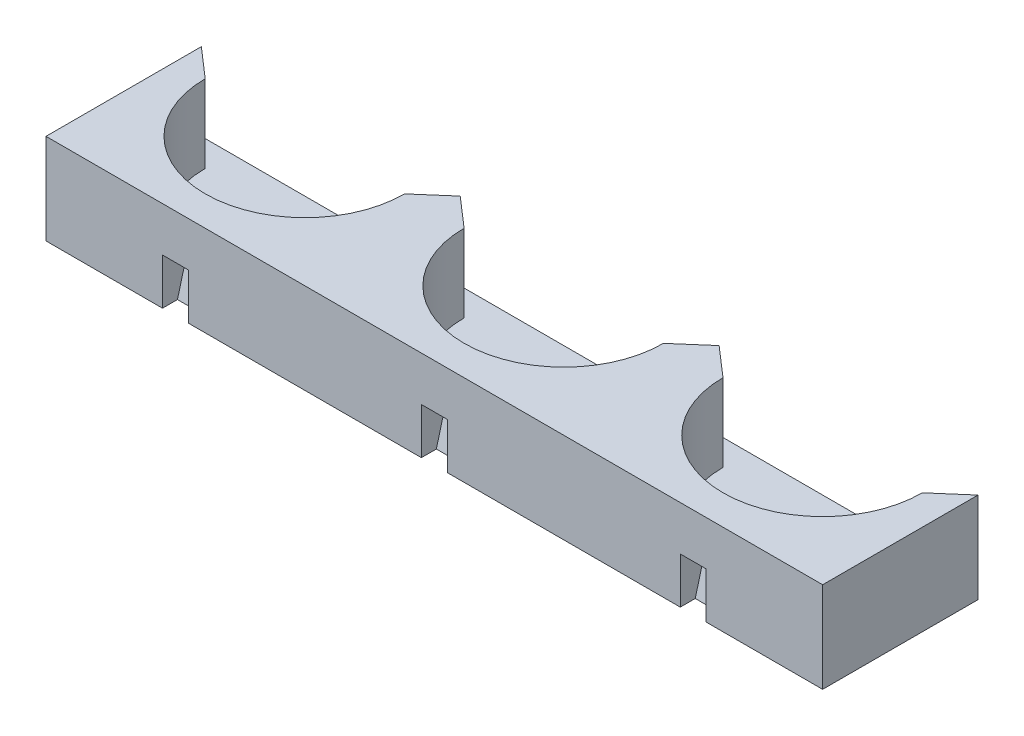
ISO-10303-21;
HEADER;
FILE_DESCRIPTION(('STEP AP214'),'2;1');
FILE_NAME('part.step','',(''),(''),'','','');
FILE_SCHEMA(('AUTOMOTIVE_DESIGN { 1 0 10303 214 1 1 1 1 }'));
ENDSEC;
DATA;
#1=APPLICATION_CONTEXT('core data for automotive mechanical design processes');
#2=APPLICATION_PROTOCOL_DEFINITION('international standard','automotive_design',2000,#1);
#3=PRODUCT_CONTEXT('',#1,'mechanical');
#4=PRODUCT('Part','Part','',(#3));
#5=PRODUCT_RELATED_PRODUCT_CATEGORY('part','',(#4));
#6=PRODUCT_DEFINITION_FORMATION('','',#4);
#7=PRODUCT_DEFINITION_CONTEXT('part definition',#1,'design');
#8=PRODUCT_DEFINITION('design','',#6,#7);
#9=PRODUCT_DEFINITION_SHAPE('','',#8);
#10=(LENGTH_UNIT() NAMED_UNIT(*) SI_UNIT(.MILLI.,.METRE.));
#11=(NAMED_UNIT(*) PLANE_ANGLE_UNIT() SI_UNIT($,.RADIAN.));
#12=(NAMED_UNIT(*) SI_UNIT($,.STERADIAN.) SOLID_ANGLE_UNIT());
#13=UNCERTAINTY_MEASURE_WITH_UNIT(LENGTH_MEASURE(1.E-05),#10,'distance_accuracy_value','');
#14=(GEOMETRIC_REPRESENTATION_CONTEXT(3) GLOBAL_UNCERTAINTY_ASSIGNED_CONTEXT((#13)) GLOBAL_UNIT_ASSIGNED_CONTEXT((#10,
#11,#12)) REPRESENTATION_CONTEXT('',''));
#15=CARTESIAN_POINT('',(0.,0.,0.));
#16=DIRECTION('',(0.,0.,1.));
#17=DIRECTION('',(1.,0.,0.));
#18=AXIS2_PLACEMENT_3D('',#15,#16,#17);
#19=CARTESIAN_POINT('',(255.,8.99626522292862,-3.75028796353544));
#20=DIRECTION('',(1.,0.,0.));
#21=DIRECTION('',(0.,0.,-1.));
#22=AXIS2_PLACEMENT_3D('',#19,#20,#21);
#23=PLANE('',#22);
#24=DIRECTION('',(0.,0.370686519168984,0.928758044113957));
#25=VECTOR('',#24,1.);
#26=CARTESIAN_POINT('',(255.,8.99626522292862,-9.53028796353547));
#27=LINE('',#26,#25);
#28=CARTESIAN_POINT('',(255.,8.99626522292862,-9.53028796353547));
#29=VERTEX_POINT('',#28);
#30=CARTESIAN_POINT('',(255.,12.8,0.));
#31=VERTEX_POINT('',#30);
#32=EDGE_CURVE('E376',#29,#31,#27,.T.);
#33=ORIENTED_EDGE('',*,*,#32,.F.);
#34=DIRECTION('',(0.,-0.96592582628907,0.258819045102515));
#35=VECTOR('',#34,1.);
#36=CARTESIAN_POINT('',(255.,8.99626522292862,-9.53028796353544));
#37=LINE('',#36,#35);
#38=CARTESIAN_POINT('',(255.,-5.,-5.78000000000001));
#39=VERTEX_POINT('',#38);
#40=EDGE_CURVE('E414',#29,#39,#37,.T.);
#41=ORIENTED_EDGE('',*,*,#40,.T.);
#42=DIRECTION('',(0.,0.,1.));
#43=VECTOR('',#42,1.);
#44=CARTESIAN_POINT('',(255.,-5.,0.));
#45=LINE('',#44,#43);
#46=CARTESIAN_POINT('',(255.,-5.,0.));
#47=VERTEX_POINT('',#46);
#48=EDGE_CURVE('E404',#39,#47,#45,.T.);
#49=ORIENTED_EDGE('',*,*,#48,.T.);
#50=DIRECTION('',(0.,1.,0.));
#51=VECTOR('',#50,1.);
#52=CARTESIAN_POINT('',(255.,-5.,0.));
#53=LINE('',#52,#51);
#54=EDGE_CURVE('E208',#47,#31,#53,.T.);
#55=ORIENTED_EDGE('',*,*,#54,.T.);
#56=EDGE_LOOP('',(#33,#41,#49,#55));
#57=FACE_BOUND('',#56,.T.);
#58=ADVANCED_FACE('F33',(#57),#23,.F.);
#59=CARTESIAN_POINT('',(245.,8.99626522292862,-3.75028796353544));
#60=DIRECTION('',(-1.,0.,0.));
#61=DIRECTION('',(0.,0.,1.));
#62=AXIS2_PLACEMENT_3D('',#59,#60,#61);
#63=PLANE('',#62);
#64=DIRECTION('',(0.,0.370686519168984,0.928758044113957));
#65=VECTOR('',#64,1.);
#66=CARTESIAN_POINT('',(245.,8.99626522292862,-9.53028796353547));
#67=LINE('',#66,#65);
#68=CARTESIAN_POINT('',(245.,8.99626522292862,-9.53028796353544));
#69=VERTEX_POINT('',#68);
#70=CARTESIAN_POINT('',(245.,12.8,0.));
#71=VERTEX_POINT('',#70);
#72=EDGE_CURVE('E448',#69,#71,#67,.T.);
#73=ORIENTED_EDGE('',*,*,#72,.T.);
#74=DIRECTION('',(0.,-1.,0.));
#75=VECTOR('',#74,1.);
#76=CARTESIAN_POINT('',(245.,-5.,0.));
#77=LINE('',#76,#75);
#78=CARTESIAN_POINT('',(245.,-5.,0.));
#79=VERTEX_POINT('',#78);
#80=EDGE_CURVE('E397',#71,#79,#77,.T.);
#81=ORIENTED_EDGE('',*,*,#80,.T.);
#82=DIRECTION('',(0.,0.,-1.));
#83=VECTOR('',#82,1.);
#84=CARTESIAN_POINT('',(245.,-5.,0.));
#85=LINE('',#84,#83);
#86=CARTESIAN_POINT('',(245.,-5.,-5.78000000000001));
#87=VERTEX_POINT('',#86);
#88=EDGE_CURVE('E420',#79,#87,#85,.T.);
#89=ORIENTED_EDGE('',*,*,#88,.T.);
#90=DIRECTION('',(0.,-0.96592582628907,0.258819045102515));
#91=VECTOR('',#90,1.);
#92=CARTESIAN_POINT('',(245.,8.99626522292862,-9.53028796353544));
#93=LINE('',#92,#91);
#94=EDGE_CURVE('E411',#69,#87,#93,.T.);
#95=ORIENTED_EDGE('',*,*,#94,.F.);
#96=EDGE_LOOP('',(#73,#81,#89,#95));
#97=FACE_BOUND('',#96,.T.);
#98=ADVANCED_FACE('F462',(#97),#63,.F.);
#99=CARTESIAN_POINT('',(155.,8.99626522292862,-3.75028796353546));
#100=DIRECTION('',(1.,0.,0.));
#101=DIRECTION('',(0.,0.,-1.));
#102=AXIS2_PLACEMENT_3D('',#99,#100,#101);
#103=PLANE('',#102);
#104=DIRECTION('',(0.,0.370686519168984,0.928758044113957));
#105=VECTOR('',#104,1.);
#106=CARTESIAN_POINT('',(155.,8.99626522292862,-9.53028796353547));
#107=LINE('',#106,#105);
#108=CARTESIAN_POINT('',(155.,8.99626522292862,-9.53028796353547));
#109=VERTEX_POINT('',#108);
#110=CARTESIAN_POINT('',(155.,12.8,0.));
#111=VERTEX_POINT('',#110);
#112=EDGE_CURVE('E364',#109,#111,#107,.T.);
#113=ORIENTED_EDGE('',*,*,#112,.F.);
#114=DIRECTION('',(0.,-0.96592582628907,0.258819045102515));
#115=VECTOR('',#114,1.);
#116=CARTESIAN_POINT('',(155.,8.99626522292862,-9.53028796353546));
#117=LINE('',#116,#115);
#118=CARTESIAN_POINT('',(155.,-5.,-5.78000000000003));
#119=VERTEX_POINT('',#118);
#120=EDGE_CURVE('E368',#109,#119,#117,.T.);
#121=ORIENTED_EDGE('',*,*,#120,.T.);
#122=DIRECTION('',(0.,0.,1.));
#123=VECTOR('',#122,1.);
#124=CARTESIAN_POINT('',(155.,-5.,0.));
#125=LINE('',#124,#123);
#126=CARTESIAN_POINT('',(155.,-5.,0.));
#127=VERTEX_POINT('',#126);
#128=EDGE_CURVE('E396',#119,#127,#125,.T.);
#129=ORIENTED_EDGE('',*,*,#128,.T.);
#130=DIRECTION('',(0.,1.,0.));
#131=VECTOR('',#130,1.);
#132=CARTESIAN_POINT('',(155.,-5.,0.));
#133=LINE('',#132,#131);
#134=EDGE_CURVE('E371',#127,#111,#133,.T.);
#135=ORIENTED_EDGE('',*,*,#134,.T.);
#136=EDGE_LOOP('',(#113,#121,#129,#135));
#137=FACE_BOUND('',#136,.T.);
#138=ADVANCED_FACE('F366',(#137),#103,.F.);
#139=CARTESIAN_POINT('',(145.,8.99626522292862,-3.75028796353547));
#140=DIRECTION('',(-1.,0.,0.));
#141=DIRECTION('',(0.,0.,1.));
#142=AXIS2_PLACEMENT_3D('',#139,#140,#141);
#143=PLANE('',#142);
#144=DIRECTION('',(0.,0.370686519168984,0.928758044113957));
#145=VECTOR('',#144,1.);
#146=CARTESIAN_POINT('',(145.,8.99626522292862,-9.53028796353547));
#147=LINE('',#146,#145);
#148=CARTESIAN_POINT('',(145.,8.99626522292862,-9.53028796353547));
#149=VERTEX_POINT('',#148);
#150=CARTESIAN_POINT('',(145.,12.8,0.));
#151=VERTEX_POINT('',#150);
#152=EDGE_CURVE('E375',#149,#151,#147,.T.);
#153=ORIENTED_EDGE('',*,*,#152,.T.);
#154=DIRECTION('',(0.,-1.,0.));
#155=VECTOR('',#154,1.);
#156=CARTESIAN_POINT('',(145.,-5.,0.));
#157=LINE('',#156,#155);
#158=CARTESIAN_POINT('',(145.,-5.,0.));
#159=VERTEX_POINT('',#158);
#160=EDGE_CURVE('E433',#151,#159,#157,.T.);
#161=ORIENTED_EDGE('',*,*,#160,.T.);
#162=DIRECTION('',(0.,0.,-1.));
#163=VECTOR('',#162,1.);
#164=CARTESIAN_POINT('',(145.,-5.,0.));
#165=LINE('',#164,#163);
#166=CARTESIAN_POINT('',(145.,-5.,-5.78000000000003));
#167=VERTEX_POINT('',#166);
#168=EDGE_CURVE('E394',#159,#167,#165,.T.);
#169=ORIENTED_EDGE('',*,*,#168,.T.);
#170=DIRECTION('',(0.,-0.96592582628907,0.258819045102515));
#171=VECTOR('',#170,1.);
#172=CARTESIAN_POINT('',(145.,8.99626522292862,-9.53028796353547));
#173=LINE('',#172,#171);
#174=EDGE_CURVE('E230',#149,#167,#173,.T.);
#175=ORIENTED_EDGE('',*,*,#174,.F.);
#176=EDGE_LOOP('',(#153,#161,#169,#175));
#177=FACE_BOUND('',#176,.T.);
#178=ADVANCED_FACE('F504',(#177),#143,.F.);
#179=CARTESIAN_POINT('',(45.,8.99626522292862,-3.75028796353544));
#180=DIRECTION('',(-1.,0.,0.));
#181=DIRECTION('',(0.,0.,1.));
#182=AXIS2_PLACEMENT_3D('',#179,#180,#181);
#183=PLANE('',#182);
#184=DIRECTION('',(0.,0.370686519168984,0.928758044113957));
#185=VECTOR('',#184,1.);
#186=CARTESIAN_POINT('',(45.,8.99626522292862,-9.53028796353547));
#187=LINE('',#186,#185);
#188=CARTESIAN_POINT('',(45.,8.99626522292862,-9.53028796353547));
#189=VERTEX_POINT('',#188);
#190=CARTESIAN_POINT('',(45.,12.8,0.));
#191=VERTEX_POINT('',#190);
#192=EDGE_CURVE('E432',#189,#191,#187,.T.);
#193=ORIENTED_EDGE('',*,*,#192,.T.);
#194=DIRECTION('',(0.,-1.,0.));
#195=VECTOR('',#194,1.);
#196=CARTESIAN_POINT('',(45.,-5.,0.));
#197=LINE('',#196,#195);
#198=CARTESIAN_POINT('',(45.,-5.,0.));
#199=VERTEX_POINT('',#198);
#200=EDGE_CURVE('E425',#191,#199,#197,.T.);
#201=ORIENTED_EDGE('',*,*,#200,.T.);
#202=DIRECTION('',(0.,0.,-1.));
#203=VECTOR('',#202,1.);
#204=CARTESIAN_POINT('',(45.,-5.,0.));
#205=LINE('',#204,#203);
#206=CARTESIAN_POINT('',(45.,-5.,-5.78000000000003));
#207=VERTEX_POINT('',#206);
#208=EDGE_CURVE('E48',#199,#207,#205,.T.);
#209=ORIENTED_EDGE('',*,*,#208,.T.);
#210=DIRECTION('',(0.,-0.96592582628907,0.258819045102515));
#211=VECTOR('',#210,1.);
#212=CARTESIAN_POINT('',(45.,8.99626522292862,-9.53028796353547));
#213=LINE('',#212,#211);
#214=EDGE_CURVE('E399',#189,#207,#213,.T.);
#215=ORIENTED_EDGE('',*,*,#214,.F.);
#216=EDGE_LOOP('',(#193,#201,#209,#215));
#217=FACE_BOUND('',#216,.T.);
#218=ADVANCED_FACE('F479',(#217),#183,.F.);
#219=CARTESIAN_POINT('',(55.,8.99626522292862,-3.75028796353544));
#220=DIRECTION('',(1.,0.,0.));
#221=DIRECTION('',(0.,0.,-1.));
#222=AXIS2_PLACEMENT_3D('',#219,#220,#221);
#223=PLANE('',#222);
#224=DIRECTION('',(0.,0.370686519168984,0.928758044113957));
#225=VECTOR('',#224,1.);
#226=CARTESIAN_POINT('',(55.,8.99626522292862,-9.53028796353547));
#227=LINE('',#226,#225);
#228=CARTESIAN_POINT('',(55.,8.99626522292862,-9.53028796353547));
#229=VERTEX_POINT('',#228);
#230=CARTESIAN_POINT('',(55.,12.8,0.));
#231=VERTEX_POINT('',#230);
#232=EDGE_CURVE('E445',#229,#231,#227,.T.);
#233=ORIENTED_EDGE('',*,*,#232,.F.);
#234=DIRECTION('',(0.,-0.96592582628907,0.258819045102515));
#235=VECTOR('',#234,1.);
#236=CARTESIAN_POINT('',(55.,8.99626522292862,-9.53028796353547));
#237=LINE('',#236,#235);
#238=CARTESIAN_POINT('',(55.,-5.,-5.78000000000003));
#239=VERTEX_POINT('',#238);
#240=EDGE_CURVE('E401',#229,#239,#237,.T.);
#241=ORIENTED_EDGE('',*,*,#240,.T.);
#242=DIRECTION('',(0.,0.,1.));
#243=VECTOR('',#242,1.);
#244=CARTESIAN_POINT('',(55.,-5.,0.));
#245=LINE('',#244,#243);
#246=CARTESIAN_POINT('',(55.,-5.,0.));
#247=VERTEX_POINT('',#246);
#248=EDGE_CURVE('E405',#239,#247,#245,.T.);
#249=ORIENTED_EDGE('',*,*,#248,.T.);
#250=DIRECTION('',(0.,1.,0.));
#251=VECTOR('',#250,1.);
#252=CARTESIAN_POINT('',(55.,-5.,0.));
#253=LINE('',#252,#251);
#254=EDGE_CURVE('E429',#247,#231,#253,.T.);
#255=ORIENTED_EDGE('',*,*,#254,.T.);
#256=EDGE_LOOP('',(#233,#241,#249,#255));
#257=FACE_BOUND('',#256,.T.);
#258=ADVANCED_FACE('F474',(#257),#223,.F.);
#259=CARTESIAN_POINT('',(0.,30.,0.));
#260=DIRECTION('',(1.,0.,0.));
#261=DIRECTION('',(0.,0.,-1.));
#262=AXIS2_PLACEMENT_3D('',#259,#260,#261);
#263=PLANE('',#262);
#264=DIRECTION('',(0.,-1.,0.));
#265=VECTOR('',#264,1.);
#266=CARTESIAN_POINT('',(0.,30.,-60.));
#267=LINE('',#266,#265);
#268=CARTESIAN_POINT('',(0.,30.,-60.));
#269=VERTEX_POINT('',#268);
#270=CARTESIAN_POINT('',(0.,0.,-60.));
#271=VERTEX_POINT('',#270);
#272=EDGE_CURVE('E137',#269,#271,#267,.T.);
#273=ORIENTED_EDGE('',*,*,#272,.T.);
#274=DIRECTION('',(0.,1.,0.));
#275=VECTOR('',#274,1.);
#276=CARTESIAN_POINT('',(0.,-5.,-60.));
#277=LINE('',#276,#275);
#278=CARTESIAN_POINT('',(0.,-5.,-60.));
#279=VERTEX_POINT('',#278);
#280=EDGE_CURVE('E143',#279,#271,#277,.T.);
#281=ORIENTED_EDGE('',*,*,#280,.F.);
#282=DIRECTION('',(0.,0.,-1.));
#283=VECTOR('',#282,1.);
#284=CARTESIAN_POINT('',(0.,-5.,-60.));
#285=LINE('',#284,#283);
#286=CARTESIAN_POINT('',(0.,-5.,0.));
#287=VERTEX_POINT('',#286);
#288=EDGE_CURVE('E211',#287,#279,#285,.T.);
#289=ORIENTED_EDGE('',*,*,#288,.F.);
#290=DIRECTION('',(0.,-1.,0.));
#291=VECTOR('',#290,1.);
#292=CARTESIAN_POINT('',(0.,30.,0.));
#293=LINE('',#292,#291);
#294=CARTESIAN_POINT('',(0.,30.,0.));
#295=VERTEX_POINT('',#294);
#296=EDGE_CURVE('E11',#295,#287,#293,.T.);
#297=ORIENTED_EDGE('',*,*,#296,.F.);
#298=DIRECTION('',(0.,0.,1.));
#299=VECTOR('',#298,1.);
#300=CARTESIAN_POINT('',(0.,30.,0.));
#301=LINE('',#300,#299);
#302=EDGE_CURVE('E161',#269,#295,#301,.T.);
#303=ORIENTED_EDGE('',*,*,#302,.F.);
#304=EDGE_LOOP('',(#273,#281,#289,#297,#303));
#305=FACE_BOUND('',#304,.T.);
#306=ADVANCED_FACE('F35',(#305),#263,.F.);
#307=CARTESIAN_POINT('',(0.,30.,0.));
#308=DIRECTION('',(0.,0.,-1.));
#309=DIRECTION('',(-1.,0.,0.));
#310=AXIS2_PLACEMENT_3D('',#307,#308,#309);
#311=PLANE('',#310);
#312=DIRECTION('',(-1.,0.,0.));
#313=VECTOR('',#312,1.);
#314=CARTESIAN_POINT('',(255.,12.8,0.));
#315=LINE('',#314,#313);
#316=EDGE_CURVE('E439',#31,#71,#315,.T.);
#317=ORIENTED_EDGE('',*,*,#316,.F.);
#318=ORIENTED_EDGE('',*,*,#54,.F.);
#319=DIRECTION('',(-1.,0.,0.));
#320=VECTOR('',#319,1.);
#321=CARTESIAN_POINT('',(300.,-5.,0.));
#322=LINE('',#321,#320);
#323=CARTESIAN_POINT('',(300.,-5.,0.));
#324=VERTEX_POINT('',#323);
#325=EDGE_CURVE('E203',#324,#47,#322,.T.);
#326=ORIENTED_EDGE('',*,*,#325,.F.);
#327=DIRECTION('',(0.,-1.,0.));
#328=VECTOR('',#327,1.);
#329=CARTESIAN_POINT('',(300.,30.,0.));
#330=LINE('',#329,#328);
#331=CARTESIAN_POINT('',(300.,30.,0.));
#332=VERTEX_POINT('',#331);
#333=EDGE_CURVE('E41',#332,#324,#330,.T.);
#334=ORIENTED_EDGE('',*,*,#333,.F.);
#335=DIRECTION('',(1.,0.,0.));
#336=VECTOR('',#335,1.);
#337=CARTESIAN_POINT('',(0.,30.,0.));
#338=LINE('',#337,#336);
#339=EDGE_CURVE('E240',#295,#332,#338,.T.);
#340=ORIENTED_EDGE('',*,*,#339,.F.);
#341=ORIENTED_EDGE('',*,*,#296,.T.);
#342=EDGE_CURVE('E214',#199,#287,#322,.T.);
#343=ORIENTED_EDGE('',*,*,#342,.F.);
#344=ORIENTED_EDGE('',*,*,#200,.F.);
#345=DIRECTION('',(-1.,0.,0.));
#346=VECTOR('',#345,1.);
#347=CARTESIAN_POINT('',(55.,12.8,0.));
#348=LINE('',#347,#346);
#349=EDGE_CURVE('E427',#231,#191,#348,.T.);
#350=ORIENTED_EDGE('',*,*,#349,.F.);
#351=ORIENTED_EDGE('',*,*,#254,.F.);
#352=EDGE_CURVE('E224',#159,#247,#322,.T.);
#353=ORIENTED_EDGE('',*,*,#352,.F.);
#354=ORIENTED_EDGE('',*,*,#160,.F.);
#355=DIRECTION('',(-1.,0.,0.));
#356=VECTOR('',#355,1.);
#357=CARTESIAN_POINT('',(155.,12.8,0.));
#358=LINE('',#357,#356);
#359=EDGE_CURVE('E435',#111,#151,#358,.T.);
#360=ORIENTED_EDGE('',*,*,#359,.F.);
#361=ORIENTED_EDGE('',*,*,#134,.F.);
#362=EDGE_CURVE('E212',#79,#127,#322,.T.);
#363=ORIENTED_EDGE('',*,*,#362,.F.);
#364=ORIENTED_EDGE('',*,*,#80,.F.);
#365=EDGE_LOOP('',(#317,#318,#326,#334,#340,#341,#343,#344,#350,#351,#353,#354,#360,#361,#363,#364));
#366=FACE_BOUND('',#365,.T.);
#367=ADVANCED_FACE('F205',(#366),#311,.F.);
#368=CARTESIAN_POINT('',(300.,30.,0.));
#369=DIRECTION('',(-1.,0.,0.));
#370=DIRECTION('',(0.,0.,1.));
#371=AXIS2_PLACEMENT_3D('',#368,#369,#370);
#372=PLANE('',#371);
#373=ORIENTED_EDGE('',*,*,#333,.T.);
#374=DIRECTION('',(0.,0.,1.));
#375=VECTOR('',#374,1.);
#376=CARTESIAN_POINT('',(300.,-5.,-60.));
#377=LINE('',#376,#375);
#378=CARTESIAN_POINT('',(300.,-5.,-60.));
#379=VERTEX_POINT('',#378);
#380=EDGE_CURVE('E194',#379,#324,#377,.T.);
#381=ORIENTED_EDGE('',*,*,#380,.F.);
#382=DIRECTION('',(0.,1.,0.));
#383=VECTOR('',#382,1.);
#384=CARTESIAN_POINT('',(300.,-5.,-60.));
#385=LINE('',#384,#383);
#386=CARTESIAN_POINT('',(300.,0.,-60.));
#387=VERTEX_POINT('',#386);
#388=EDGE_CURVE('E234',#379,#387,#385,.T.);
#389=ORIENTED_EDGE('',*,*,#388,.T.);
#390=DIRECTION('',(0.,-1.,0.));
#391=VECTOR('',#390,1.);
#392=CARTESIAN_POINT('',(300.,30.,-60.));
#393=LINE('',#392,#391);
#394=CARTESIAN_POINT('',(300.,30.,-60.));
#395=VERTEX_POINT('',#394);
#396=EDGE_CURVE('E181',#395,#387,#393,.T.);
#397=ORIENTED_EDGE('',*,*,#396,.F.);
#398=DIRECTION('',(0.,0.,-1.));
#399=VECTOR('',#398,1.);
#400=CARTESIAN_POINT('',(300.,30.,0.));
#401=LINE('',#400,#399);
#402=EDGE_CURVE('E196',#332,#395,#401,.T.);
#403=ORIENTED_EDGE('',*,*,#402,.F.);
#404=EDGE_LOOP('',(#373,#381,#389,#397,#403));
#405=FACE_BOUND('',#404,.T.);
#406=ADVANCED_FACE('F190',(#405),#372,.F.);
#407=CARTESIAN_POINT('',(288.5,30.,-50.));
#408=DIRECTION('',(0.656178714924788,0.,0.754605522163504));
#409=DIRECTION('',(0.754605522163504,0.,-0.656178714924788));
#410=AXIS2_PLACEMENT_3D('',#407,#408,#409);
#411=PLANE('',#410);
#412=DIRECTION('',(-0.754605522163504,0.,0.656178714924788));
#413=VECTOR('',#412,1.);
#414=CARTESIAN_POINT('',(288.5,0.,-50.));
#415=LINE('',#414,#413);
#416=CARTESIAN_POINT('',(288.5,0.,-50.));
#417=VERTEX_POINT('',#416);
#418=EDGE_CURVE('E141',#387,#417,#415,.T.);
#419=ORIENTED_EDGE('',*,*,#418,.T.);
#420=DIRECTION('',(0.,-1.,0.));
#421=VECTOR('',#420,1.);
#422=CARTESIAN_POINT('',(288.5,30.,-50.));
#423=LINE('',#422,#421);
#424=CARTESIAN_POINT('',(288.5,30.,-50.));
#425=VERTEX_POINT('',#424);
#426=EDGE_CURVE('E178',#425,#417,#423,.T.);
#427=ORIENTED_EDGE('',*,*,#426,.F.);
#428=DIRECTION('',(-0.754605522163504,0.,0.656178714924788));
#429=VECTOR('',#428,1.);
#430=CARTESIAN_POINT('',(288.5,30.,-50.));
#431=LINE('',#430,#429);
#432=EDGE_CURVE('E243',#395,#425,#431,.T.);
#433=ORIENTED_EDGE('',*,*,#432,.F.);
#434=ORIENTED_EDGE('',*,*,#396,.T.);
#435=EDGE_LOOP('',(#419,#427,#433,#434));
#436=FACE_BOUND('',#435,.T.);
#437=ADVANCED_FACE('F541',(#436),#411,.F.);
#438=CARTESIAN_POINT('',(250.,30.,-50.));
#439=DIRECTION('',(0.,-1.,0.));
#440=DIRECTION('',(0.,0.,-1.));
#441=AXIS2_PLACEMENT_3D('',#438,#439,#440);
#442=CYLINDRICAL_SURFACE('',#441,38.5);
#443=CARTESIAN_POINT('',(250.,0.,-50.));
#444=DIRECTION('',(0.,-1.,0.));
#445=DIRECTION('',(0.,0.,-1.));
#446=AXIS2_PLACEMENT_3D('',#443,#444,#445);
#447=CIRCLE('',#446,38.5);
#448=CARTESIAN_POINT('',(211.5,0.,-50.));
#449=VERTEX_POINT('',#448);
#450=EDGE_CURVE('E70',#417,#449,#447,.T.);
#451=ORIENTED_EDGE('',*,*,#450,.T.);
#452=DIRECTION('',(0.,-1.,0.));
#453=VECTOR('',#452,1.);
#454=CARTESIAN_POINT('',(211.5,30.,-50.));
#455=LINE('',#454,#453);
#456=CARTESIAN_POINT('',(211.5,30.,-50.));
#457=VERTEX_POINT('',#456);
#458=EDGE_CURVE('E175',#457,#449,#455,.T.);
#459=ORIENTED_EDGE('',*,*,#458,.F.);
#460=CARTESIAN_POINT('',(250.,30.,-50.));
#461=DIRECTION('',(0.,-1.,0.));
#462=DIRECTION('',(0.,0.,-1.));
#463=AXIS2_PLACEMENT_3D('',#460,#461,#462);
#464=CIRCLE('',#463,38.5);
#465=EDGE_CURVE('E245',#425,#457,#464,.T.);
#466=ORIENTED_EDGE('',*,*,#465,.F.);
#467=ORIENTED_EDGE('',*,*,#426,.T.);
#468=EDGE_LOOP('',(#451,#459,#466,#467));
#469=FACE_BOUND('',#468,.T.);
#470=ADVANCED_FACE('F537',(#469),#442,.F.);
#471=CARTESIAN_POINT('',(200.,30.,-60.));
#472=DIRECTION('',(-0.656178714924787,0.,0.754605522163504));
#473=DIRECTION('',(0.754605522163505,0.,0.656178714924787));
#474=AXIS2_PLACEMENT_3D('',#471,#472,#473);
#475=PLANE('',#474);
#476=DIRECTION('',(-0.754605522163504,0.,-0.656178714924787));
#477=VECTOR('',#476,1.);
#478=CARTESIAN_POINT('',(200.,0.,-60.));
#479=LINE('',#478,#477);
#480=CARTESIAN_POINT('',(200.,0.,-60.));
#481=VERTEX_POINT('',#480);
#482=EDGE_CURVE('E145',#449,#481,#479,.T.);
#483=ORIENTED_EDGE('',*,*,#482,.T.);
#484=DIRECTION('',(0.,-1.,0.));
#485=VECTOR('',#484,1.);
#486=CARTESIAN_POINT('',(200.,30.,-60.));
#487=LINE('',#486,#485);
#488=CARTESIAN_POINT('',(200.,30.,-60.));
#489=VERTEX_POINT('',#488);
#490=EDGE_CURVE('E172',#489,#481,#487,.T.);
#491=ORIENTED_EDGE('',*,*,#490,.F.);
#492=DIRECTION('',(-0.754605522163504,0.,-0.656178714924787));
#493=VECTOR('',#492,1.);
#494=CARTESIAN_POINT('',(200.,30.,-60.));
#495=LINE('',#494,#493);
#496=EDGE_CURVE('E247',#457,#489,#495,.T.);
#497=ORIENTED_EDGE('',*,*,#496,.F.);
#498=ORIENTED_EDGE('',*,*,#458,.T.);
#499=EDGE_LOOP('',(#483,#491,#497,#498));
#500=FACE_BOUND('',#499,.T.);
#501=ADVANCED_FACE('F533',(#500),#475,.F.);
#502=CARTESIAN_POINT('',(188.5,30.,-50.));
#503=DIRECTION('',(0.656178714924787,0.,0.754605522163505));
#504=DIRECTION('',(0.754605522163505,0.,-0.656178714924787));
#505=AXIS2_PLACEMENT_3D('',#502,#503,#504);
#506=PLANE('',#505);
#507=DIRECTION('',(-0.754605522163505,0.,0.656178714924787));
#508=VECTOR('',#507,1.);
#509=CARTESIAN_POINT('',(188.5,0.,-50.));
#510=LINE('',#509,#508);
#511=CARTESIAN_POINT('',(188.5,0.,-50.));
#512=VERTEX_POINT('',#511);
#513=EDGE_CURVE('E148',#481,#512,#510,.T.);
#514=ORIENTED_EDGE('',*,*,#513,.T.);
#515=DIRECTION('',(0.,-1.,0.));
#516=VECTOR('',#515,1.);
#517=CARTESIAN_POINT('',(188.5,30.,-50.));
#518=LINE('',#517,#516);
#519=CARTESIAN_POINT('',(188.5,30.,-50.));
#520=VERTEX_POINT('',#519);
#521=EDGE_CURVE('E169',#520,#512,#518,.T.);
#522=ORIENTED_EDGE('',*,*,#521,.F.);
#523=DIRECTION('',(-0.754605522163505,0.,0.656178714924787));
#524=VECTOR('',#523,1.);
#525=CARTESIAN_POINT('',(188.5,30.,-50.));
#526=LINE('',#525,#524);
#527=EDGE_CURVE('E249',#489,#520,#526,.T.);
#528=ORIENTED_EDGE('',*,*,#527,.F.);
#529=ORIENTED_EDGE('',*,*,#490,.T.);
#530=EDGE_LOOP('',(#514,#522,#528,#529));
#531=FACE_BOUND('',#530,.T.);
#532=ADVANCED_FACE('F530',(#531),#506,.F.);
#533=CARTESIAN_POINT('',(150.,30.,-50.));
#534=DIRECTION('',(0.,-1.,0.));
#535=DIRECTION('',(0.,0.,-1.));
#536=AXIS2_PLACEMENT_3D('',#533,#534,#535);
#537=CYLINDRICAL_SURFACE('',#536,38.5);
#538=CARTESIAN_POINT('',(150.,0.,-50.));
#539=DIRECTION('',(0.,-1.,0.));
#540=DIRECTION('',(0.,0.,1.));
#541=AXIS2_PLACEMENT_3D('',#538,#539,#540);
#542=CIRCLE('',#541,38.5);
#543=CARTESIAN_POINT('',(111.5,0.,-50.));
#544=VERTEX_POINT('',#543);
#545=EDGE_CURVE('E151',#512,#544,#542,.T.);
#546=ORIENTED_EDGE('',*,*,#545,.T.);
#547=DIRECTION('',(0.,-1.,0.));
#548=VECTOR('',#547,1.);
#549=CARTESIAN_POINT('',(111.5,30.,-50.));
#550=LINE('',#549,#548);
#551=CARTESIAN_POINT('',(111.5,30.,-50.));
#552=VERTEX_POINT('',#551);
#553=EDGE_CURVE('E166',#552,#544,#550,.T.);
#554=ORIENTED_EDGE('',*,*,#553,.F.);
#555=CARTESIAN_POINT('',(150.,30.,-50.));
#556=DIRECTION('',(0.,-1.,0.));
#557=DIRECTION('',(0.,0.,1.));
#558=AXIS2_PLACEMENT_3D('',#555,#556,#557);
#559=CIRCLE('',#558,38.5);
#560=EDGE_CURVE('E251',#520,#552,#559,.T.);
#561=ORIENTED_EDGE('',*,*,#560,.F.);
#562=ORIENTED_EDGE('',*,*,#521,.T.);
#563=EDGE_LOOP('',(#546,#554,#561,#562));
#564=FACE_BOUND('',#563,.T.);
#565=ADVANCED_FACE('F257',(#564),#537,.F.);
#566=CARTESIAN_POINT('',(111.5,30.,-50.));
#567=DIRECTION('',(-0.656178714924787,0.,0.754605522163505));
#568=DIRECTION('',(0.754605522163505,0.,0.656178714924787));
#569=AXIS2_PLACEMENT_3D('',#566,#567,#568);
#570=PLANE('',#569);
#571=DIRECTION('',(-0.754605522163505,0.,-0.656178714924787));
#572=VECTOR('',#571,1.);
#573=CARTESIAN_POINT('',(111.5,0.,-50.));
#574=LINE('',#573,#572);
#575=CARTESIAN_POINT('',(100.,0.,-60.));
#576=VERTEX_POINT('',#575);
#577=EDGE_CURVE('E154',#544,#576,#574,.T.);
#578=ORIENTED_EDGE('',*,*,#577,.T.);
#579=DIRECTION('',(0.,-1.,0.));
#580=VECTOR('',#579,1.);
#581=CARTESIAN_POINT('',(100.,30.,-60.));
#582=LINE('',#581,#580);
#583=CARTESIAN_POINT('',(100.,30.,-60.));
#584=VERTEX_POINT('',#583);
#585=EDGE_CURVE('E131',#584,#576,#582,.T.);
#586=ORIENTED_EDGE('',*,*,#585,.F.);
#587=DIRECTION('',(-0.754605522163505,0.,-0.656178714924787));
#588=VECTOR('',#587,1.);
#589=CARTESIAN_POINT('',(111.5,30.,-50.));
#590=LINE('',#589,#588);
#591=EDGE_CURVE('E119',#552,#584,#590,.T.);
#592=ORIENTED_EDGE('',*,*,#591,.F.);
#593=ORIENTED_EDGE('',*,*,#553,.T.);
#594=EDGE_LOOP('',(#578,#586,#592,#593));
#595=FACE_BOUND('',#594,.T.);
#596=ADVANCED_FACE('F260',(#595),#570,.F.);
#597=CARTESIAN_POINT('',(100.,30.,-60.));
#598=DIRECTION('',(0.656178714924787,0.,0.754605522163504));
#599=DIRECTION('',(0.754605522163505,0.,-0.656178714924787));
#600=AXIS2_PLACEMENT_3D('',#597,#598,#599);
#601=PLANE('',#600);
#602=DIRECTION('',(-0.754605522163504,0.,0.656178714924787));
#603=VECTOR('',#602,1.);
#604=CARTESIAN_POINT('',(100.,0.,-60.));
#605=LINE('',#604,#603);
#606=CARTESIAN_POINT('',(88.5,0.,-50.));
#607=VERTEX_POINT('',#606);
#608=EDGE_CURVE('E129',#576,#607,#605,.T.);
#609=ORIENTED_EDGE('',*,*,#608,.T.);
#610=DIRECTION('',(0.,-1.,0.));
#611=VECTOR('',#610,1.);
#612=CARTESIAN_POINT('',(88.5,30.,-50.));
#613=LINE('',#612,#611);
#614=CARTESIAN_POINT('',(88.5,30.,-50.));
#615=VERTEX_POINT('',#614);
#616=EDGE_CURVE('E126',#615,#607,#613,.T.);
#617=ORIENTED_EDGE('',*,*,#616,.F.);
#618=DIRECTION('',(-0.754605522163504,0.,0.656178714924787));
#619=VECTOR('',#618,1.);
#620=CARTESIAN_POINT('',(100.,30.,-60.));
#621=LINE('',#620,#619);
#622=EDGE_CURVE('E112',#584,#615,#621,.T.);
#623=ORIENTED_EDGE('',*,*,#622,.F.);
#624=ORIENTED_EDGE('',*,*,#585,.T.);
#625=EDGE_LOOP('',(#609,#617,#623,#624));
#626=FACE_BOUND('',#625,.T.);
#627=ADVANCED_FACE('F127',(#626),#601,.F.);
#628=CARTESIAN_POINT('',(50.,30.,-50.));
#629=DIRECTION('',(0.,-1.,0.));
#630=DIRECTION('',(0.,0.,-1.));
#631=AXIS2_PLACEMENT_3D('',#628,#629,#630);
#632=CYLINDRICAL_SURFACE('',#631,38.5);
#633=CARTESIAN_POINT('',(50.,0.,-50.));
#634=DIRECTION('',(0.,-1.,0.));
#635=DIRECTION('',(0.,0.,1.));
#636=AXIS2_PLACEMENT_3D('',#633,#634,#635);
#637=CIRCLE('',#636,38.5);
#638=CARTESIAN_POINT('',(11.5,0.,-50.));
#639=VERTEX_POINT('',#638);
#640=EDGE_CURVE('E158',#607,#639,#637,.T.);
#641=ORIENTED_EDGE('',*,*,#640,.T.);
#642=DIRECTION('',(0.,-1.,0.));
#643=VECTOR('',#642,1.);
#644=CARTESIAN_POINT('',(11.5,30.,-50.));
#645=LINE('',#644,#643);
#646=CARTESIAN_POINT('',(11.5,30.,-50.));
#647=VERTEX_POINT('',#646);
#648=EDGE_CURVE('E132',#647,#639,#645,.T.);
#649=ORIENTED_EDGE('',*,*,#648,.F.);
#650=CARTESIAN_POINT('',(50.,30.,-50.));
#651=DIRECTION('',(0.,-1.,0.));
#652=DIRECTION('',(0.,0.,1.));
#653=AXIS2_PLACEMENT_3D('',#650,#651,#652);
#654=CIRCLE('',#653,38.5);
#655=EDGE_CURVE('E116',#615,#647,#654,.T.);
#656=ORIENTED_EDGE('',*,*,#655,.F.);
#657=ORIENTED_EDGE('',*,*,#616,.T.);
#658=EDGE_LOOP('',(#641,#649,#656,#657));
#659=FACE_BOUND('',#658,.T.);
#660=ADVANCED_FACE('F134',(#659),#632,.F.);
#661=CARTESIAN_POINT('',(11.5,30.,-50.));
#662=DIRECTION('',(-0.656178714924787,0.,0.754605522163505));
#663=DIRECTION('',(0.754605522163505,0.,0.656178714924787));
#664=AXIS2_PLACEMENT_3D('',#661,#662,#663);
#665=PLANE('',#664);
#666=DIRECTION('',(-0.754605522163505,0.,-0.656178714924787));
#667=VECTOR('',#666,1.);
#668=CARTESIAN_POINT('',(11.5,0.,-50.));
#669=LINE('',#668,#667);
#670=EDGE_CURVE('E82',#639,#271,#669,.T.);
#671=ORIENTED_EDGE('',*,*,#670,.T.);
#672=ORIENTED_EDGE('',*,*,#272,.F.);
#673=DIRECTION('',(-0.754605522163505,0.,-0.656178714924787));
#674=VECTOR('',#673,1.);
#675=CARTESIAN_POINT('',(11.5,30.,-50.));
#676=LINE('',#675,#674);
#677=EDGE_CURVE('E57',#647,#269,#676,.T.);
#678=ORIENTED_EDGE('',*,*,#677,.F.);
#679=ORIENTED_EDGE('',*,*,#648,.T.);
#680=EDGE_LOOP('',(#671,#672,#678,#679));
#681=FACE_BOUND('',#680,.T.);
#682=ADVANCED_FACE('F288',(#681),#665,.F.);
#683=CARTESIAN_POINT('',(50.,30.,-50.));
#684=DIRECTION('',(0.,1.,0.));
#685=DIRECTION('',(0.,0.,1.));
#686=AXIS2_PLACEMENT_3D('',#683,#684,#685);
#687=PLANE('',#686);
#688=ORIENTED_EDGE('',*,*,#302,.T.);
#689=ORIENTED_EDGE('',*,*,#339,.T.);
#690=ORIENTED_EDGE('',*,*,#402,.T.);
#691=ORIENTED_EDGE('',*,*,#432,.T.);
#692=ORIENTED_EDGE('',*,*,#465,.T.);
#693=ORIENTED_EDGE('',*,*,#496,.T.);
#694=ORIENTED_EDGE('',*,*,#527,.T.);
#695=ORIENTED_EDGE('',*,*,#560,.T.);
#696=ORIENTED_EDGE('',*,*,#591,.T.);
#697=ORIENTED_EDGE('',*,*,#622,.T.);
#698=ORIENTED_EDGE('',*,*,#655,.T.);
#699=ORIENTED_EDGE('',*,*,#677,.T.);
#700=EDGE_LOOP('',(#688,#689,#690,#691,#692,#693,#694,#695,#696,#697,#698,#699));
#701=FACE_BOUND('',#700,.T.);
#702=ADVANCED_FACE('F114',(#701),#687,.T.);
#703=CARTESIAN_POINT('',(0.,0.,0.));
#704=DIRECTION('',(0.,-1.,0.));
#705=DIRECTION('',(0.,0.,-1.));
#706=AXIS2_PLACEMENT_3D('',#703,#704,#705);
#707=PLANE('',#706);
#708=ORIENTED_EDGE('',*,*,#670,.F.);
#709=ORIENTED_EDGE('',*,*,#640,.F.);
#710=ORIENTED_EDGE('',*,*,#608,.F.);
#711=DIRECTION('',(1.,0.,0.));
#712=VECTOR('',#711,1.);
#713=CARTESIAN_POINT('',(300.,0.,-60.));
#714=LINE('',#713,#712);
#715=EDGE_CURVE('E221',#271,#576,#714,.T.);
#716=ORIENTED_EDGE('',*,*,#715,.F.);
#717=EDGE_LOOP('',(#708,#709,#710,#716));
#718=FACE_BOUND('',#717,.T.);
#719=ADVANCED_FACE('F285',(#718),#707,.F.);
#720=ORIENTED_EDGE('',*,*,#577,.F.);
#721=ORIENTED_EDGE('',*,*,#545,.F.);
#722=ORIENTED_EDGE('',*,*,#513,.F.);
#723=EDGE_CURVE('E226',#576,#481,#714,.T.);
#724=ORIENTED_EDGE('',*,*,#723,.F.);
#725=EDGE_LOOP('',(#720,#721,#722,#724));
#726=FACE_BOUND('',#725,.T.);
#727=ADVANCED_FACE('F277',(#726),#707,.F.);
#728=CARTESIAN_POINT('',(300.,-5.,-60.));
#729=DIRECTION('',(0.,0.,1.));
#730=DIRECTION('',(1.,0.,0.));
#731=AXIS2_PLACEMENT_3D('',#728,#729,#730);
#732=PLANE('',#731);
#733=ORIENTED_EDGE('',*,*,#715,.T.);
#734=ORIENTED_EDGE('',*,*,#723,.T.);
#735=EDGE_CURVE('E228',#481,#387,#714,.T.);
#736=ORIENTED_EDGE('',*,*,#735,.T.);
#737=ORIENTED_EDGE('',*,*,#388,.F.);
#738=DIRECTION('',(1.,0.,0.));
#739=VECTOR('',#738,1.);
#740=CARTESIAN_POINT('',(300.,-5.,-60.));
#741=LINE('',#740,#739);
#742=EDGE_CURVE('E219',#279,#379,#741,.T.);
#743=ORIENTED_EDGE('',*,*,#742,.F.);
#744=ORIENTED_EDGE('',*,*,#280,.T.);
#745=EDGE_LOOP('',(#733,#734,#736,#737,#743,#744));
#746=FACE_BOUND('',#745,.T.);
#747=ADVANCED_FACE('F282',(#746),#732,.F.);
#748=CARTESIAN_POINT('',(0.,-5.,0.));
#749=DIRECTION('',(0.,-1.,0.));
#750=DIRECTION('',(0.,0.,-1.));
#751=AXIS2_PLACEMENT_3D('',#748,#749,#750);
#752=PLANE('',#751);
#753=ORIENTED_EDGE('',*,*,#48,.F.);
#754=DIRECTION('',(1.,0.,0.));
#755=VECTOR('',#754,1.);
#756=CARTESIAN_POINT('',(255.,-5.,-5.78000000000001));
#757=LINE('',#756,#755);
#758=EDGE_CURVE('E417',#87,#39,#757,.T.);
#759=ORIENTED_EDGE('',*,*,#758,.F.);
#760=ORIENTED_EDGE('',*,*,#88,.F.);
#761=ORIENTED_EDGE('',*,*,#362,.T.);
#762=ORIENTED_EDGE('',*,*,#128,.F.);
#763=DIRECTION('',(1.,0.,0.));
#764=VECTOR('',#763,1.);
#765=CARTESIAN_POINT('',(155.,-5.,-5.78000000000003));
#766=LINE('',#765,#764);
#767=EDGE_CURVE('E385',#167,#119,#766,.T.);
#768=ORIENTED_EDGE('',*,*,#767,.F.);
#769=ORIENTED_EDGE('',*,*,#168,.F.);
#770=ORIENTED_EDGE('',*,*,#352,.T.);
#771=ORIENTED_EDGE('',*,*,#248,.F.);
#772=DIRECTION('',(1.,0.,0.));
#773=VECTOR('',#772,1.);
#774=CARTESIAN_POINT('',(45.,-5.,-5.78000000000003));
#775=LINE('',#774,#773);
#776=EDGE_CURVE('E390',#207,#239,#775,.T.);
#777=ORIENTED_EDGE('',*,*,#776,.F.);
#778=ORIENTED_EDGE('',*,*,#208,.F.);
#779=ORIENTED_EDGE('',*,*,#342,.T.);
#780=ORIENTED_EDGE('',*,*,#288,.T.);
#781=ORIENTED_EDGE('',*,*,#742,.T.);
#782=ORIENTED_EDGE('',*,*,#380,.T.);
#783=ORIENTED_EDGE('',*,*,#325,.T.);
#784=EDGE_LOOP('',(#753,#759,#760,#761,#762,#768,#769,#770,#771,#777,#778,#779,#780,#781,#782,#783));
#785=FACE_BOUND('',#784,.T.);
#786=ADVANCED_FACE('F216',(#785),#752,.T.);
#787=ORIENTED_EDGE('',*,*,#482,.F.);
#788=ORIENTED_EDGE('',*,*,#450,.F.);
#789=ORIENTED_EDGE('',*,*,#418,.F.);
#790=ORIENTED_EDGE('',*,*,#735,.F.);
#791=EDGE_LOOP('',(#787,#788,#789,#790));
#792=FACE_BOUND('',#791,.T.);
#793=ADVANCED_FACE('F507',(#792),#707,.F.);
#794=CARTESIAN_POINT('',(155.,8.99626522292862,-9.53028796353546));
#795=DIRECTION('',(0.,-0.258819045102515,-0.96592582628907));
#796=DIRECTION('',(0.,0.96592582628907,-0.258819045102515));
#797=AXIS2_PLACEMENT_3D('',#794,#795,#796);
#798=PLANE('',#797);
#799=ORIENTED_EDGE('',*,*,#767,.T.);
#800=ORIENTED_EDGE('',*,*,#120,.F.);
#801=DIRECTION('',(1.,0.,0.));
#802=VECTOR('',#801,1.);
#803=CARTESIAN_POINT('',(155.,8.99626522292862,-9.53028796353546));
#804=LINE('',#803,#802);
#805=EDGE_CURVE('E379',#149,#109,#804,.T.);
#806=ORIENTED_EDGE('',*,*,#805,.F.);
#807=ORIENTED_EDGE('',*,*,#174,.T.);
#808=EDGE_LOOP('',(#799,#800,#806,#807));
#809=FACE_BOUND('',#808,.T.);
#810=ADVANCED_FACE('F387',(#809),#798,.F.);
#811=CARTESIAN_POINT('',(45.,8.99626522292862,-9.53028796353547));
#812=DIRECTION('',(0.,-0.258819045102515,-0.96592582628907));
#813=DIRECTION('',(0.,0.96592582628907,-0.258819045102515));
#814=AXIS2_PLACEMENT_3D('',#811,#812,#813);
#815=PLANE('',#814);
#816=ORIENTED_EDGE('',*,*,#776,.T.);
#817=ORIENTED_EDGE('',*,*,#240,.F.);
#818=DIRECTION('',(1.,0.,0.));
#819=VECTOR('',#818,1.);
#820=CARTESIAN_POINT('',(45.,8.99626522292862,-9.53028796353547));
#821=LINE('',#820,#819);
#822=EDGE_CURVE('E402',#189,#229,#821,.T.);
#823=ORIENTED_EDGE('',*,*,#822,.F.);
#824=ORIENTED_EDGE('',*,*,#214,.T.);
#825=EDGE_LOOP('',(#816,#817,#823,#824));
#826=FACE_BOUND('',#825,.T.);
#827=ADVANCED_FACE('F478',(#826),#815,.F.);
#828=CARTESIAN_POINT('',(255.,8.99626522292862,-9.53028796353544));
#829=DIRECTION('',(0.,-0.258819045102515,-0.96592582628907));
#830=DIRECTION('',(0.,0.96592582628907,-0.258819045102515));
#831=AXIS2_PLACEMENT_3D('',#828,#829,#830);
#832=PLANE('',#831);
#833=ORIENTED_EDGE('',*,*,#758,.T.);
#834=ORIENTED_EDGE('',*,*,#40,.F.);
#835=DIRECTION('',(1.,0.,0.));
#836=VECTOR('',#835,1.);
#837=CARTESIAN_POINT('',(255.,8.99626522292862,-9.53028796353544));
#838=LINE('',#837,#836);
#839=EDGE_CURVE('E415',#69,#29,#838,.T.);
#840=ORIENTED_EDGE('',*,*,#839,.F.);
#841=ORIENTED_EDGE('',*,*,#94,.T.);
#842=EDGE_LOOP('',(#833,#834,#840,#841));
#843=FACE_BOUND('',#842,.T.);
#844=ADVANCED_FACE('F465',(#843),#832,.F.);
#845=CARTESIAN_POINT('',(-0.002000000000002,8.99626522292862,-9.53028796353547));
#846=DIRECTION('',(0.,0.928758044113957,-0.370686519168984));
#847=DIRECTION('',(0.,0.370686519168984,0.928758044113957));
#848=AXIS2_PLACEMENT_3D('',#845,#846,#847);
#849=PLANE('',#848);
#850=ORIENTED_EDGE('',*,*,#192,.F.);
#851=ORIENTED_EDGE('',*,*,#822,.T.);
#852=ORIENTED_EDGE('',*,*,#232,.T.);
#853=ORIENTED_EDGE('',*,*,#349,.T.);
#854=EDGE_LOOP('',(#850,#851,#852,#853));
#855=FACE_BOUND('',#854,.T.);
#856=ADVANCED_FACE('F481',(#855),#849,.F.);
#857=CARTESIAN_POINT('',(-0.002000000000002,8.99626522292862,-9.53028796353547));
#858=DIRECTION('',(0.,0.928758044113957,-0.370686519168984));
#859=DIRECTION('',(0.,0.370686519168984,0.928758044113957));
#860=AXIS2_PLACEMENT_3D('',#857,#858,#859);
#861=PLANE('',#860);
#862=ORIENTED_EDGE('',*,*,#152,.F.);
#863=ORIENTED_EDGE('',*,*,#805,.T.);
#864=ORIENTED_EDGE('',*,*,#112,.T.);
#865=ORIENTED_EDGE('',*,*,#359,.T.);
#866=EDGE_LOOP('',(#862,#863,#864,#865));
#867=FACE_BOUND('',#866,.T.);
#868=ADVANCED_FACE('F380',(#867),#861,.F.);
#869=CARTESIAN_POINT('',(-0.002000000000002,8.99626522292862,-9.53028796353547));
#870=DIRECTION('',(0.,0.928758044113957,-0.370686519168984));
#871=DIRECTION('',(0.,0.370686519168984,0.928758044113957));
#872=AXIS2_PLACEMENT_3D('',#869,#870,#871);
#873=PLANE('',#872);
#874=ORIENTED_EDGE('',*,*,#72,.F.);
#875=ORIENTED_EDGE('',*,*,#839,.T.);
#876=ORIENTED_EDGE('',*,*,#32,.T.);
#877=ORIENTED_EDGE('',*,*,#316,.T.);
#878=EDGE_LOOP('',(#874,#875,#876,#877));
#879=FACE_BOUND('',#878,.T.);
#880=ADVANCED_FACE('F453',(#879),#873,.F.);
#881=CLOSED_SHELL('',(#58,#98,#138,#178,#218,#258,#306,#367,#406,#437,#470,#501,#532,#565,#596,
#627,#660,#682,#702,#719,#727,#747,#786,#793,#810,#827,#844,#856,#868,#880));
#882=MANIFOLD_SOLID_BREP('B2',#881);
#883=ADVANCED_BREP_SHAPE_REPRESENTATION('',(#18,#882),#14);
#884=SHAPE_DEFINITION_REPRESENTATION(#9,#883);
ENDSEC;
END-ISO-10303-21;
